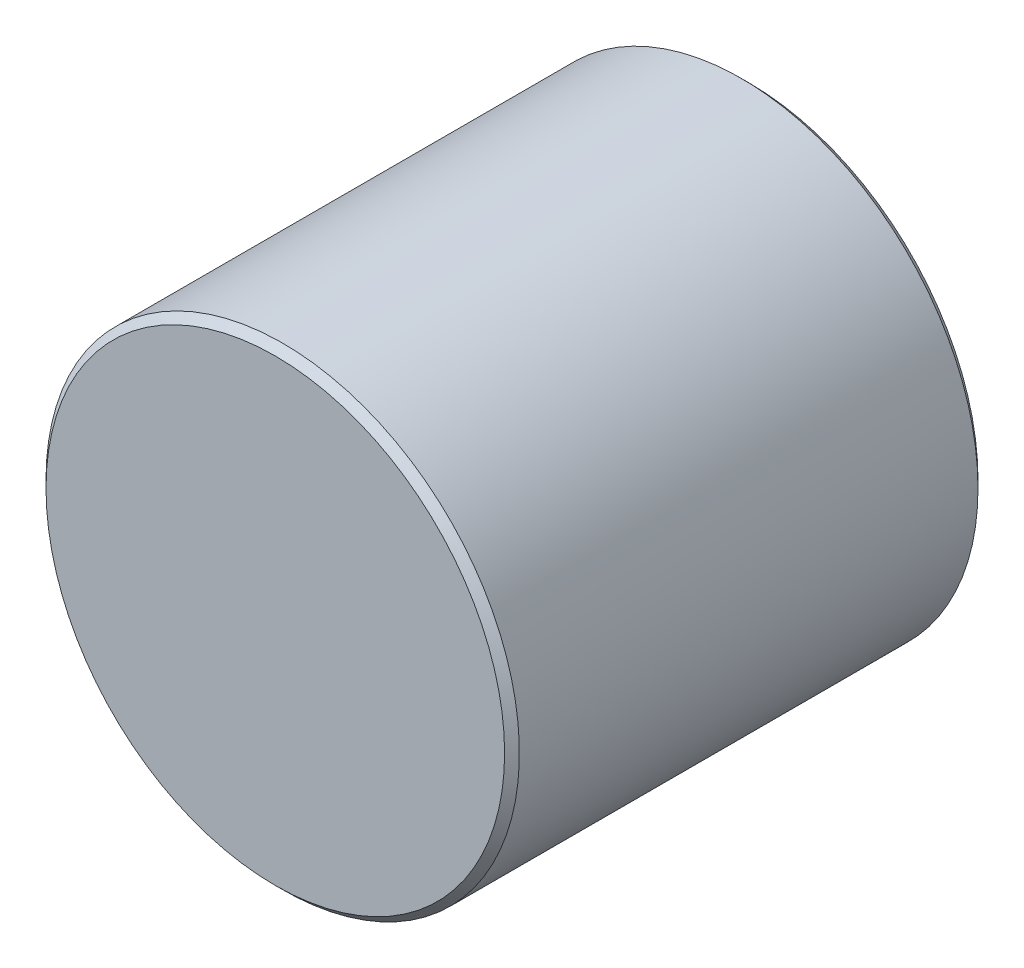
ISO-10303-21;
HEADER;
FILE_DESCRIPTION(('STEP AP214'),'2;1');
FILE_NAME('part.step','',(''),(''),'','','');
FILE_SCHEMA(('AUTOMOTIVE_DESIGN { 1 0 10303 214 1 1 1 1 }'));
ENDSEC;
DATA;
#1=APPLICATION_CONTEXT('core data for automotive mechanical design processes');
#2=APPLICATION_PROTOCOL_DEFINITION('international standard','automotive_design',2000,#1);
#3=PRODUCT_CONTEXT('',#1,'mechanical');
#4=PRODUCT('Part','Part','',(#3));
#5=PRODUCT_RELATED_PRODUCT_CATEGORY('part','',(#4));
#6=PRODUCT_DEFINITION_FORMATION('','',#4);
#7=PRODUCT_DEFINITION_CONTEXT('part definition',#1,'design');
#8=PRODUCT_DEFINITION('design','',#6,#7);
#9=PRODUCT_DEFINITION_SHAPE('','',#8);
#10=(LENGTH_UNIT() NAMED_UNIT(*) SI_UNIT(.MILLI.,.METRE.));
#11=(NAMED_UNIT(*) PLANE_ANGLE_UNIT() SI_UNIT($,.RADIAN.));
#12=(NAMED_UNIT(*) SI_UNIT($,.STERADIAN.) SOLID_ANGLE_UNIT());
#13=UNCERTAINTY_MEASURE_WITH_UNIT(LENGTH_MEASURE(1.E-05),#10,'distance_accuracy_value','');
#14=(GEOMETRIC_REPRESENTATION_CONTEXT(3) GLOBAL_UNCERTAINTY_ASSIGNED_CONTEXT((#13)) GLOBAL_UNIT_ASSIGNED_CONTEXT((#10,
#11,#12)) REPRESENTATION_CONTEXT('',''));
#15=CARTESIAN_POINT('',(0.,0.,0.));
#16=DIRECTION('',(0.,0.,1.));
#17=DIRECTION('',(1.,0.,0.));
#18=AXIS2_PLACEMENT_3D('',#15,#16,#17);
#19=CARTESIAN_POINT('',(7.75,0.,0.));
#20=DIRECTION('',(0.,0.,-1.));
#21=DIRECTION('',(-1.,0.,0.));
#22=AXIS2_PLACEMENT_3D('',#19,#20,#21);
#23=PLANE('',#22);
#24=CARTESIAN_POINT('',(0.,0.,0.));
#25=DIRECTION('',(0.,0.,1.));
#26=DIRECTION('',(1.,0.,0.));
#27=AXIS2_PLACEMENT_3D('',#24,#25,#26);
#28=CIRCLE('',#27,15.5);
#29=CARTESIAN_POINT('',(15.5,0.,0.));
#30=VERTEX_POINT('',#29);
#31=EDGE_CURVE('E16',#30,#30,#28,.T.);
#32=ORIENTED_EDGE('',*,*,#31,.F.);
#33=EDGE_LOOP('',(#32));
#34=FACE_BOUND('',#33,.T.);
#35=ADVANCED_FACE('F13',(#34),#23,.T.);
#36=CARTESIAN_POINT('',(7.75,0.,32.));
#37=DIRECTION('',(0.,0.,1.));
#38=DIRECTION('',(1.,0.,0.));
#39=AXIS2_PLACEMENT_3D('',#36,#37,#38);
#40=PLANE('',#39);
#41=CARTESIAN_POINT('',(0.,0.,32.));
#42=DIRECTION('',(0.,0.,-1.));
#43=DIRECTION('',(-1.,0.,0.));
#44=AXIS2_PLACEMENT_3D('',#41,#42,#43);
#45=CIRCLE('',#44,15.5);
#46=CARTESIAN_POINT('',(-15.5,0.,32.));
#47=VERTEX_POINT('',#46);
#48=EDGE_CURVE('E25',#47,#47,#45,.T.);
#49=ORIENTED_EDGE('',*,*,#48,.F.);
#50=EDGE_LOOP('',(#49));
#51=FACE_BOUND('',#50,.T.);
#52=ADVANCED_FACE('F37',(#51),#40,.T.);
#53=CARTESIAN_POINT('',(0.,0.,0.5));
#54=DIRECTION('',(0.,0.,1.));
#55=DIRECTION('',(1.,0.,0.));
#56=AXIS2_PLACEMENT_3D('',#53,#54,#55);
#57=CONICAL_SURFACE('',#56,16.,0.785398163397448);
#58=ORIENTED_EDGE('',*,*,#31,.T.);
#59=EDGE_LOOP('',(#58));
#60=FACE_BOUND('',#59,.T.);
#61=CARTESIAN_POINT('',(0.,0.,0.5));
#62=DIRECTION('',(0.,0.,-1.));
#63=DIRECTION('',(-1.,0.,0.));
#64=AXIS2_PLACEMENT_3D('',#61,#62,#63);
#65=CIRCLE('',#64,16.);
#66=CARTESIAN_POINT('',(-16.,0.,0.5));
#67=VERTEX_POINT('',#66);
#68=EDGE_CURVE('E20',#67,#67,#65,.F.);
#69=ORIENTED_EDGE('',*,*,#68,.F.);
#70=EDGE_LOOP('',(#69));
#71=FACE_BOUND('',#70,.T.);
#72=ADVANCED_FACE('F33',(#60,#71),#57,.T.);
#73=CARTESIAN_POINT('',(0.,0.,31.5));
#74=DIRECTION('',(0.,0.,-1.));
#75=DIRECTION('',(-1.,0.,0.));
#76=AXIS2_PLACEMENT_3D('',#73,#74,#75);
#77=CONICAL_SURFACE('',#76,16.,0.785398163397448);
#78=ORIENTED_EDGE('',*,*,#48,.T.);
#79=EDGE_LOOP('',(#78));
#80=FACE_BOUND('',#79,.T.);
#81=CARTESIAN_POINT('',(0.,0.,31.5));
#82=DIRECTION('',(0.,0.,-1.));
#83=DIRECTION('',(-1.,0.,0.));
#84=AXIS2_PLACEMENT_3D('',#81,#82,#83);
#85=CIRCLE('',#84,16.);
#86=CARTESIAN_POINT('',(-16.,0.,31.5));
#87=VERTEX_POINT('',#86);
#88=EDGE_CURVE('E9',#87,#87,#85,.T.);
#89=ORIENTED_EDGE('',*,*,#88,.F.);
#90=EDGE_LOOP('',(#89));
#91=FACE_BOUND('',#90,.T.);
#92=ADVANCED_FACE('F45',(#80,#91),#77,.T.);
#93=CARTESIAN_POINT('',(0.,0.,16.));
#94=DIRECTION('',(0.,0.,-1.));
#95=DIRECTION('',(-1.,0.,0.));
#96=AXIS2_PLACEMENT_3D('',#93,#94,#95);
#97=CYLINDRICAL_SURFACE('',#96,16.);
#98=ORIENTED_EDGE('',*,*,#68,.T.);
#99=EDGE_LOOP('',(#98));
#100=FACE_BOUND('',#99,.T.);
#101=ORIENTED_EDGE('',*,*,#88,.T.);
#102=EDGE_LOOP('',(#101));
#103=FACE_BOUND('',#102,.T.);
#104=ADVANCED_FACE('F43',(#100,#103),#97,.T.);
#105=CLOSED_SHELL('',(#35,#52,#72,#92,#104));
#106=MANIFOLD_SOLID_BREP('B1',#105);
#107=ADVANCED_BREP_SHAPE_REPRESENTATION('',(#18,#106),#14);
#108=SHAPE_DEFINITION_REPRESENTATION(#9,#107);
ENDSEC;
END-ISO-10303-21;
